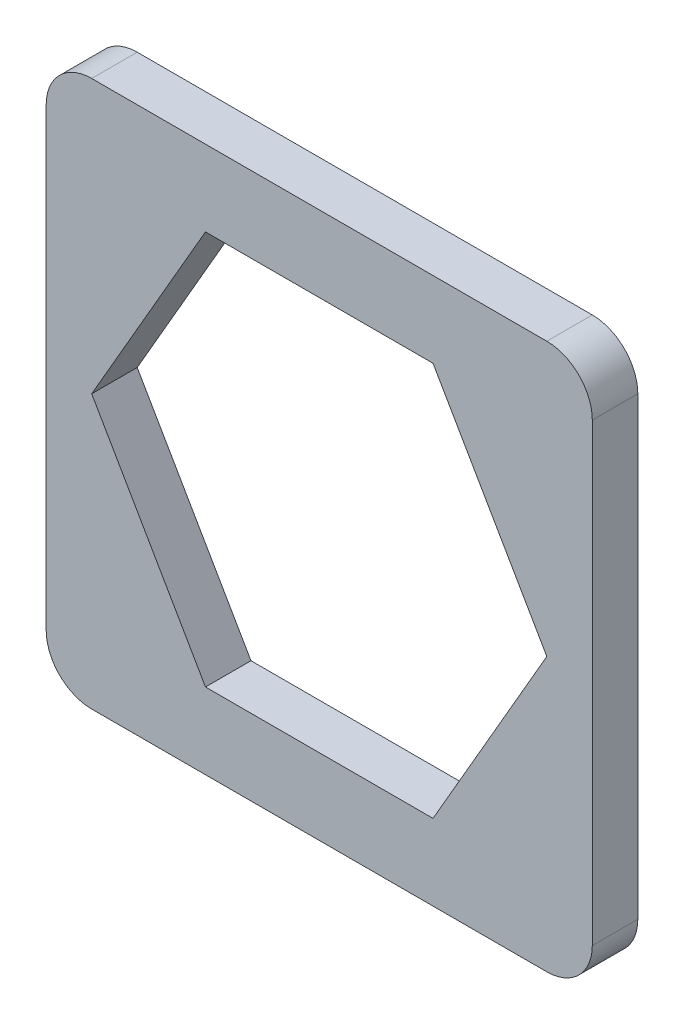
ISO-10303-21;
HEADER;
FILE_DESCRIPTION(('STEP AP214'),'2;1');
FILE_NAME('part.step','',(''),(''),'','','');
FILE_SCHEMA(('AUTOMOTIVE_DESIGN { 1 0 10303 214 1 1 1 1 }'));
ENDSEC;
DATA;
#1=APPLICATION_CONTEXT('core data for automotive mechanical design processes');
#2=APPLICATION_PROTOCOL_DEFINITION('international standard','automotive_design',2000,#1);
#3=PRODUCT_CONTEXT('',#1,'mechanical');
#4=PRODUCT('Part','Part','',(#3));
#5=PRODUCT_RELATED_PRODUCT_CATEGORY('part','',(#4));
#6=PRODUCT_DEFINITION_FORMATION('','',#4);
#7=PRODUCT_DEFINITION_CONTEXT('part definition',#1,'design');
#8=PRODUCT_DEFINITION('design','',#6,#7);
#9=PRODUCT_DEFINITION_SHAPE('','',#8);
#10=(LENGTH_UNIT() NAMED_UNIT(*) SI_UNIT(.MILLI.,.METRE.));
#11=(NAMED_UNIT(*) PLANE_ANGLE_UNIT() SI_UNIT($,.RADIAN.));
#12=(NAMED_UNIT(*) SI_UNIT($,.STERADIAN.) SOLID_ANGLE_UNIT());
#13=UNCERTAINTY_MEASURE_WITH_UNIT(LENGTH_MEASURE(1.E-05),#10,'distance_accuracy_value','');
#14=(GEOMETRIC_REPRESENTATION_CONTEXT(3) GLOBAL_UNCERTAINTY_ASSIGNED_CONTEXT((#13)) GLOBAL_UNIT_ASSIGNED_CONTEXT((#10,
#11,#12)) REPRESENTATION_CONTEXT('',''));
#15=CARTESIAN_POINT('',(0.,0.,0.));
#16=DIRECTION('',(0.,0.,1.));
#17=DIRECTION('',(1.,0.,0.));
#18=AXIS2_PLACEMENT_3D('',#15,#16,#17);
#19=CARTESIAN_POINT('',(-49.9999999999999,60.,10.));
#20=DIRECTION('',(0.,1.,0.));
#21=DIRECTION('',(0.,0.,1.));
#22=AXIS2_PLACEMENT_3D('',#19,#20,#21);
#23=PLANE('',#22);
#24=DIRECTION('',(1.,0.,0.));
#25=VECTOR('',#24,1.);
#26=CARTESIAN_POINT('',(-49.9999999999999,60.,0.));
#27=LINE('',#26,#25);
#28=CARTESIAN_POINT('',(-49.9999999999999,60.,0.));
#29=VERTEX_POINT('',#28);
#30=CARTESIAN_POINT('',(49.9999999999999,60.,0.));
#31=VERTEX_POINT('',#30);
#32=EDGE_CURVE('E179',#29,#31,#27,.T.);
#33=ORIENTED_EDGE('',*,*,#32,.F.);
#34=DIRECTION('',(0.,0.,-1.));
#35=VECTOR('',#34,1.);
#36=CARTESIAN_POINT('',(-49.9999999999999,60.,10.));
#37=LINE('',#36,#35);
#38=CARTESIAN_POINT('',(-49.9999999999999,60.,10.));
#39=VERTEX_POINT('',#38);
#40=EDGE_CURVE('E11',#39,#29,#37,.T.);
#41=ORIENTED_EDGE('',*,*,#40,.F.);
#42=DIRECTION('',(1.,0.,0.));
#43=VECTOR('',#42,1.);
#44=CARTESIAN_POINT('',(-49.9999999999999,60.,10.));
#45=LINE('',#44,#43);
#46=CARTESIAN_POINT('',(49.9999999999999,60.,10.));
#47=VERTEX_POINT('',#46);
#48=EDGE_CURVE('E187',#39,#47,#45,.T.);
#49=ORIENTED_EDGE('',*,*,#48,.T.);
#50=DIRECTION('',(0.,0.,-1.));
#51=VECTOR('',#50,1.);
#52=CARTESIAN_POINT('',(49.9999999999999,60.,10.));
#53=LINE('',#52,#51);
#54=EDGE_CURVE('E36',#47,#31,#53,.T.);
#55=ORIENTED_EDGE('',*,*,#54,.T.);
#56=EDGE_LOOP('',(#33,#41,#49,#55));
#57=FACE_BOUND('',#56,.T.);
#58=ADVANCED_FACE('F33',(#57),#23,.T.);
#59=CARTESIAN_POINT('',(-50.,50.,10.));
#60=DIRECTION('',(0.,0.,-1.));
#61=DIRECTION('',(-1.,0.,0.));
#62=AXIS2_PLACEMENT_3D('',#59,#60,#61);
#63=CYLINDRICAL_SURFACE('',#62,10.);
#64=CARTESIAN_POINT('',(-50.,50.,0.));
#65=DIRECTION('',(0.,0.,1.));
#66=DIRECTION('',(1.,0.,0.));
#67=AXIS2_PLACEMENT_3D('',#64,#65,#66);
#68=CIRCLE('',#67,10.);
#69=CARTESIAN_POINT('',(-60.,49.9999999999999,0.));
#70=VERTEX_POINT('',#69);
#71=EDGE_CURVE('E191',#29,#70,#68,.T.);
#72=ORIENTED_EDGE('',*,*,#71,.T.);
#73=DIRECTION('',(0.,0.,-1.));
#74=VECTOR('',#73,1.);
#75=CARTESIAN_POINT('',(-60.,49.9999999999999,10.));
#76=LINE('',#75,#74);
#77=CARTESIAN_POINT('',(-60.,49.9999999999999,10.));
#78=VERTEX_POINT('',#77);
#79=EDGE_CURVE('E41',#78,#70,#76,.T.);
#80=ORIENTED_EDGE('',*,*,#79,.F.);
#81=CARTESIAN_POINT('',(-50.,50.,10.));
#82=DIRECTION('',(0.,0.,1.));
#83=DIRECTION('',(1.,0.,0.));
#84=AXIS2_PLACEMENT_3D('',#81,#82,#83);
#85=CIRCLE('',#84,10.);
#86=EDGE_CURVE('E205',#39,#78,#85,.T.);
#87=ORIENTED_EDGE('',*,*,#86,.F.);
#88=ORIENTED_EDGE('',*,*,#40,.T.);
#89=EDGE_LOOP('',(#72,#80,#87,#88));
#90=FACE_BOUND('',#89,.T.);
#91=ADVANCED_FACE('F251',(#90),#63,.T.);
#92=CARTESIAN_POINT('',(-60.,49.9999999999999,10.));
#93=DIRECTION('',(1.,0.,0.));
#94=DIRECTION('',(0.,1.,0.));
#95=AXIS2_PLACEMENT_3D('',#92,#93,#94);
#96=PLANE('',#95);
#97=DIRECTION('',(0.,-1.,0.));
#98=VECTOR('',#97,1.);
#99=CARTESIAN_POINT('',(-60.,49.9999999999999,0.));
#100=LINE('',#99,#98);
#101=CARTESIAN_POINT('',(-60.,-49.9999999999999,0.));
#102=VERTEX_POINT('',#101);
#103=EDGE_CURVE('E222',#70,#102,#100,.T.);
#104=ORIENTED_EDGE('',*,*,#103,.T.);
#105=DIRECTION('',(0.,0.,-1.));
#106=VECTOR('',#105,1.);
#107=CARTESIAN_POINT('',(-60.,-49.9999999999999,10.));
#108=LINE('',#107,#106);
#109=CARTESIAN_POINT('',(-60.,-49.9999999999999,10.));
#110=VERTEX_POINT('',#109);
#111=EDGE_CURVE('E227',#110,#102,#108,.T.);
#112=ORIENTED_EDGE('',*,*,#111,.F.);
#113=DIRECTION('',(0.,-1.,0.));
#114=VECTOR('',#113,1.);
#115=CARTESIAN_POINT('',(-60.,49.9999999999999,10.));
#116=LINE('',#115,#114);
#117=EDGE_CURVE('E203',#78,#110,#116,.T.);
#118=ORIENTED_EDGE('',*,*,#117,.F.);
#119=ORIENTED_EDGE('',*,*,#79,.T.);
#120=EDGE_LOOP('',(#104,#112,#118,#119));
#121=FACE_BOUND('',#120,.T.);
#122=ADVANCED_FACE('F255',(#121),#96,.F.);
#123=CARTESIAN_POINT('',(-50.,-50.,10.));
#124=DIRECTION('',(0.,0.,-1.));
#125=DIRECTION('',(-1.,0.,0.));
#126=AXIS2_PLACEMENT_3D('',#123,#124,#125);
#127=CYLINDRICAL_SURFACE('',#126,10.);
#128=CARTESIAN_POINT('',(-50.,-50.,0.));
#129=DIRECTION('',(0.,0.,1.));
#130=DIRECTION('',(1.,0.,0.));
#131=AXIS2_PLACEMENT_3D('',#128,#129,#130);
#132=CIRCLE('',#131,10.);
#133=CARTESIAN_POINT('',(-49.9999999999999,-60.,0.));
#134=VERTEX_POINT('',#133);
#135=EDGE_CURVE('E220',#102,#134,#132,.T.);
#136=ORIENTED_EDGE('',*,*,#135,.T.);
#137=DIRECTION('',(0.,0.,-1.));
#138=VECTOR('',#137,1.);
#139=CARTESIAN_POINT('',(-49.9999999999999,-60.,10.));
#140=LINE('',#139,#138);
#141=CARTESIAN_POINT('',(-49.9999999999999,-60.,10.));
#142=VERTEX_POINT('',#141);
#143=EDGE_CURVE('E230',#142,#134,#140,.T.);
#144=ORIENTED_EDGE('',*,*,#143,.F.);
#145=CARTESIAN_POINT('',(-50.,-50.,10.));
#146=DIRECTION('',(0.,0.,1.));
#147=DIRECTION('',(1.,0.,0.));
#148=AXIS2_PLACEMENT_3D('',#145,#146,#147);
#149=CIRCLE('',#148,10.);
#150=EDGE_CURVE('E201',#110,#142,#149,.T.);
#151=ORIENTED_EDGE('',*,*,#150,.F.);
#152=ORIENTED_EDGE('',*,*,#111,.T.);
#153=EDGE_LOOP('',(#136,#144,#151,#152));
#154=FACE_BOUND('',#153,.T.);
#155=ADVANCED_FACE('F275',(#154),#127,.T.);
#156=CARTESIAN_POINT('',(-49.9999999999999,-60.,10.));
#157=DIRECTION('',(0.,1.,0.));
#158=DIRECTION('',(0.,0.,1.));
#159=AXIS2_PLACEMENT_3D('',#156,#157,#158);
#160=PLANE('',#159);
#161=DIRECTION('',(1.,0.,0.));
#162=VECTOR('',#161,1.);
#163=CARTESIAN_POINT('',(-49.9999999999999,-60.,0.));
#164=LINE('',#163,#162);
#165=CARTESIAN_POINT('',(49.9999999999999,-60.,0.));
#166=VERTEX_POINT('',#165);
#167=EDGE_CURVE('E218',#134,#166,#164,.T.);
#168=ORIENTED_EDGE('',*,*,#167,.T.);
#169=DIRECTION('',(0.,0.,-1.));
#170=VECTOR('',#169,1.);
#171=CARTESIAN_POINT('',(49.9999999999999,-60.,10.));
#172=LINE('',#171,#170);
#173=CARTESIAN_POINT('',(49.9999999999999,-60.,10.));
#174=VERTEX_POINT('',#173);
#175=EDGE_CURVE('E233',#174,#166,#172,.T.);
#176=ORIENTED_EDGE('',*,*,#175,.F.);
#177=DIRECTION('',(1.,0.,0.));
#178=VECTOR('',#177,1.);
#179=CARTESIAN_POINT('',(-49.9999999999999,-60.,10.));
#180=LINE('',#179,#178);
#181=EDGE_CURVE('E199',#142,#174,#180,.T.);
#182=ORIENTED_EDGE('',*,*,#181,.F.);
#183=ORIENTED_EDGE('',*,*,#143,.T.);
#184=EDGE_LOOP('',(#168,#176,#182,#183));
#185=FACE_BOUND('',#184,.T.);
#186=ADVANCED_FACE('F273',(#185),#160,.F.);
#187=CARTESIAN_POINT('',(50.,-50.,10.));
#188=DIRECTION('',(0.,0.,-1.));
#189=DIRECTION('',(-1.,0.,0.));
#190=AXIS2_PLACEMENT_3D('',#187,#188,#189);
#191=CYLINDRICAL_SURFACE('',#190,10.);
#192=CARTESIAN_POINT('',(50.,-50.,0.));
#193=DIRECTION('',(0.,0.,1.));
#194=DIRECTION('',(1.,0.,0.));
#195=AXIS2_PLACEMENT_3D('',#192,#193,#194);
#196=CIRCLE('',#195,10.);
#197=CARTESIAN_POINT('',(60.,-50.,0.));
#198=VERTEX_POINT('',#197);
#199=EDGE_CURVE('E215',#166,#198,#196,.T.);
#200=ORIENTED_EDGE('',*,*,#199,.T.);
#201=DIRECTION('',(0.,0.,-1.));
#202=VECTOR('',#201,1.);
#203=CARTESIAN_POINT('',(60.,-50.,10.));
#204=LINE('',#203,#202);
#205=CARTESIAN_POINT('',(60.,-50.,10.));
#206=VERTEX_POINT('',#205);
#207=EDGE_CURVE('E236',#206,#198,#204,.T.);
#208=ORIENTED_EDGE('',*,*,#207,.F.);
#209=CARTESIAN_POINT('',(50.,-50.,10.));
#210=DIRECTION('',(0.,0.,1.));
#211=DIRECTION('',(1.,0.,0.));
#212=AXIS2_PLACEMENT_3D('',#209,#210,#211);
#213=CIRCLE('',#212,10.);
#214=EDGE_CURVE('E197',#174,#206,#213,.T.);
#215=ORIENTED_EDGE('',*,*,#214,.F.);
#216=ORIENTED_EDGE('',*,*,#175,.T.);
#217=EDGE_LOOP('',(#200,#208,#215,#216));
#218=FACE_BOUND('',#217,.T.);
#219=ADVANCED_FACE('F269',(#218),#191,.T.);
#220=CARTESIAN_POINT('',(60.,49.9999999999999,10.));
#221=DIRECTION('',(1.,0.,0.));
#222=DIRECTION('',(0.,1.,0.));
#223=AXIS2_PLACEMENT_3D('',#220,#221,#222);
#224=PLANE('',#223);
#225=DIRECTION('',(0.,-1.,0.));
#226=VECTOR('',#225,1.);
#227=CARTESIAN_POINT('',(60.,49.9999999999999,0.));
#228=LINE('',#227,#226);
#229=CARTESIAN_POINT('',(60.,49.9999999999999,0.));
#230=VERTEX_POINT('',#229);
#231=EDGE_CURVE('E212',#230,#198,#228,.T.);
#232=ORIENTED_EDGE('',*,*,#231,.F.);
#233=DIRECTION('',(0.,0.,-1.));
#234=VECTOR('',#233,1.);
#235=CARTESIAN_POINT('',(60.,49.9999999999999,10.));
#236=LINE('',#235,#234);
#237=CARTESIAN_POINT('',(60.,49.9999999999999,10.));
#238=VERTEX_POINT('',#237);
#239=EDGE_CURVE('E237',#238,#230,#236,.T.);
#240=ORIENTED_EDGE('',*,*,#239,.F.);
#241=DIRECTION('',(0.,-1.,0.));
#242=VECTOR('',#241,1.);
#243=CARTESIAN_POINT('',(60.,49.9999999999999,10.));
#244=LINE('',#243,#242);
#245=EDGE_CURVE('E194',#238,#206,#244,.T.);
#246=ORIENTED_EDGE('',*,*,#245,.T.);
#247=ORIENTED_EDGE('',*,*,#207,.T.);
#248=EDGE_LOOP('',(#232,#240,#246,#247));
#249=FACE_BOUND('',#248,.T.);
#250=ADVANCED_FACE('F265',(#249),#224,.T.);
#251=CARTESIAN_POINT('',(50.,50.,10.));
#252=DIRECTION('',(0.,0.,-1.));
#253=DIRECTION('',(-1.,0.,0.));
#254=AXIS2_PLACEMENT_3D('',#251,#252,#253);
#255=CYLINDRICAL_SURFACE('',#254,10.);
#256=CARTESIAN_POINT('',(50.,50.,0.));
#257=DIRECTION('',(0.,0.,-1.));
#258=DIRECTION('',(-1.,0.,0.));
#259=AXIS2_PLACEMENT_3D('',#256,#257,#258);
#260=CIRCLE('',#259,10.);
#261=EDGE_CURVE('E209',#31,#230,#260,.T.);
#262=ORIENTED_EDGE('',*,*,#261,.F.);
#263=ORIENTED_EDGE('',*,*,#54,.F.);
#264=CARTESIAN_POINT('',(50.,50.,10.));
#265=DIRECTION('',(0.,0.,-1.));
#266=DIRECTION('',(-1.,0.,0.));
#267=AXIS2_PLACEMENT_3D('',#264,#265,#266);
#268=CIRCLE('',#267,10.);
#269=EDGE_CURVE('E190',#47,#238,#268,.T.);
#270=ORIENTED_EDGE('',*,*,#269,.T.);
#271=ORIENTED_EDGE('',*,*,#239,.T.);
#272=EDGE_LOOP('',(#262,#263,#270,#271));
#273=FACE_BOUND('',#272,.T.);
#274=ADVANCED_FACE('F245',(#273),#255,.T.);
#275=CARTESIAN_POINT('',(50.,50.,10.));
#276=DIRECTION('',(0.,0.,-1.));
#277=DIRECTION('',(-1.,0.,0.));
#278=AXIS2_PLACEMENT_3D('',#275,#276,#277);
#279=PLANE('',#278);
#280=DIRECTION('',(0.5,0.866025403784439,0.));
#281=VECTOR('',#280,1.);
#282=CARTESIAN_POINT('',(25.,-43.3012701892219,10.));
#283=LINE('',#282,#281);
#284=CARTESIAN_POINT('',(25.,-43.301270189222,10.));
#285=VERTEX_POINT('',#284);
#286=CARTESIAN_POINT('',(50.,0.,10.));
#287=VERTEX_POINT('',#286);
#288=EDGE_CURVE('E167',#285,#287,#283,.T.);
#289=ORIENTED_EDGE('',*,*,#288,.F.);
#290=DIRECTION('',(1.,0.,0.));
#291=VECTOR('',#290,1.);
#292=CARTESIAN_POINT('',(-25.,-43.3012701892219,10.));
#293=LINE('',#292,#291);
#294=CARTESIAN_POINT('',(-25.,-43.3012701892219,10.));
#295=VERTEX_POINT('',#294);
#296=EDGE_CURVE('E49',#295,#285,#293,.T.);
#297=ORIENTED_EDGE('',*,*,#296,.F.);
#298=DIRECTION('',(0.5,-0.866025403784439,0.));
#299=VECTOR('',#298,1.);
#300=CARTESIAN_POINT('',(-50.,0.,10.));
#301=LINE('',#300,#299);
#302=CARTESIAN_POINT('',(-50.,0.,10.));
#303=VERTEX_POINT('',#302);
#304=EDGE_CURVE('E153',#303,#295,#301,.T.);
#305=ORIENTED_EDGE('',*,*,#304,.F.);
#306=DIRECTION('',(-0.5,-0.866025403784439,0.));
#307=VECTOR('',#306,1.);
#308=CARTESIAN_POINT('',(-25.,43.3012701892219,10.));
#309=LINE('',#308,#307);
#310=CARTESIAN_POINT('',(-25.,43.3012701892219,10.));
#311=VERTEX_POINT('',#310);
#312=EDGE_CURVE('E156',#311,#303,#309,.T.);
#313=ORIENTED_EDGE('',*,*,#312,.F.);
#314=DIRECTION('',(-1.,0.,0.));
#315=VECTOR('',#314,1.);
#316=CARTESIAN_POINT('',(25.,43.3012701892219,10.));
#317=LINE('',#316,#315);
#318=CARTESIAN_POINT('',(25.,43.3012701892219,10.));
#319=VERTEX_POINT('',#318);
#320=EDGE_CURVE('E172',#319,#311,#317,.T.);
#321=ORIENTED_EDGE('',*,*,#320,.F.);
#322=DIRECTION('',(-0.5,0.866025403784439,0.));
#323=VECTOR('',#322,1.);
#324=CARTESIAN_POINT('',(50.,0.,10.));
#325=LINE('',#324,#323);
#326=EDGE_CURVE('E169',#287,#319,#325,.T.);
#327=ORIENTED_EDGE('',*,*,#326,.F.);
#328=EDGE_LOOP('',(#289,#297,#305,#313,#321,#327));
#329=FACE_BOUND('',#328,.T.);
#330=ORIENTED_EDGE('',*,*,#48,.F.);
#331=ORIENTED_EDGE('',*,*,#86,.T.);
#332=ORIENTED_EDGE('',*,*,#117,.T.);
#333=ORIENTED_EDGE('',*,*,#150,.T.);
#334=ORIENTED_EDGE('',*,*,#181,.T.);
#335=ORIENTED_EDGE('',*,*,#214,.T.);
#336=ORIENTED_EDGE('',*,*,#245,.F.);
#337=ORIENTED_EDGE('',*,*,#269,.F.);
#338=EDGE_LOOP('',(#330,#331,#332,#333,#334,#335,#336,#337));
#339=FACE_BOUND('',#338,.T.);
#340=ADVANCED_FACE('F259',(#329,#339),#279,.F.);
#341=CARTESIAN_POINT('',(50.,50.,0.));
#342=DIRECTION('',(0.,0.,-1.));
#343=DIRECTION('',(-1.,0.,0.));
#344=AXIS2_PLACEMENT_3D('',#341,#342,#343);
#345=PLANE('',#344);
#346=DIRECTION('',(1.,0.,0.));
#347=VECTOR('',#346,1.);
#348=CARTESIAN_POINT('',(-25.,-43.3012701892219,0.));
#349=LINE('',#348,#347);
#350=CARTESIAN_POINT('',(-25.,-43.3012701892219,0.));
#351=VERTEX_POINT('',#350);
#352=CARTESIAN_POINT('',(25.,-43.3012701892219,0.));
#353=VERTEX_POINT('',#352);
#354=EDGE_CURVE('E136',#351,#353,#349,.T.);
#355=ORIENTED_EDGE('',*,*,#354,.T.);
#356=DIRECTION('',(0.5,0.866025403784439,0.));
#357=VECTOR('',#356,1.);
#358=CARTESIAN_POINT('',(25.,-43.3012701892219,0.));
#359=LINE('',#358,#357);
#360=CARTESIAN_POINT('',(50.,0.,0.));
#361=VERTEX_POINT('',#360);
#362=EDGE_CURVE('E145',#353,#361,#359,.T.);
#363=ORIENTED_EDGE('',*,*,#362,.T.);
#364=DIRECTION('',(-0.5,0.866025403784439,0.));
#365=VECTOR('',#364,1.);
#366=CARTESIAN_POINT('',(50.,0.,0.));
#367=LINE('',#366,#365);
#368=CARTESIAN_POINT('',(25.,43.3012701892219,0.));
#369=VERTEX_POINT('',#368);
#370=EDGE_CURVE('E57',#361,#369,#367,.T.);
#371=ORIENTED_EDGE('',*,*,#370,.T.);
#372=DIRECTION('',(-1.,0.,0.));
#373=VECTOR('',#372,1.);
#374=CARTESIAN_POINT('',(25.,43.3012701892219,0.));
#375=LINE('',#374,#373);
#376=CARTESIAN_POINT('',(-25.,43.3012701892219,0.));
#377=VERTEX_POINT('',#376);
#378=EDGE_CURVE('E160',#369,#377,#375,.T.);
#379=ORIENTED_EDGE('',*,*,#378,.T.);
#380=DIRECTION('',(-0.5,-0.866025403784439,0.));
#381=VECTOR('',#380,1.);
#382=CARTESIAN_POINT('',(-25.,43.3012701892219,0.));
#383=LINE('',#382,#381);
#384=CARTESIAN_POINT('',(-50.,0.,0.));
#385=VERTEX_POINT('',#384);
#386=EDGE_CURVE('E163',#377,#385,#383,.T.);
#387=ORIENTED_EDGE('',*,*,#386,.T.);
#388=DIRECTION('',(0.5,-0.866025403784439,0.));
#389=VECTOR('',#388,1.);
#390=CARTESIAN_POINT('',(-50.,0.,0.));
#391=LINE('',#390,#389);
#392=EDGE_CURVE('E142',#385,#351,#391,.T.);
#393=ORIENTED_EDGE('',*,*,#392,.T.);
#394=EDGE_LOOP('',(#355,#363,#371,#379,#387,#393));
#395=FACE_BOUND('',#394,.T.);
#396=ORIENTED_EDGE('',*,*,#32,.T.);
#397=ORIENTED_EDGE('',*,*,#261,.T.);
#398=ORIENTED_EDGE('',*,*,#231,.T.);
#399=ORIENTED_EDGE('',*,*,#199,.F.);
#400=ORIENTED_EDGE('',*,*,#167,.F.);
#401=ORIENTED_EDGE('',*,*,#135,.F.);
#402=ORIENTED_EDGE('',*,*,#103,.F.);
#403=ORIENTED_EDGE('',*,*,#71,.F.);
#404=EDGE_LOOP('',(#396,#397,#398,#399,#400,#401,#402,#403));
#405=FACE_BOUND('',#404,.T.);
#406=ADVANCED_FACE('F149',(#395,#405),#345,.T.);
#407=CARTESIAN_POINT('',(-25.,-43.3012701892219,0.));
#408=DIRECTION('',(0.,-1.,0.));
#409=DIRECTION('',(0.,0.,-1.));
#410=AXIS2_PLACEMENT_3D('',#407,#408,#409);
#411=PLANE('',#410);
#412=ORIENTED_EDGE('',*,*,#296,.T.);
#413=DIRECTION('',(0.,0.,1.));
#414=VECTOR('',#413,1.);
#415=CARTESIAN_POINT('',(25.,-43.3012701892219,0.));
#416=LINE('',#415,#414);
#417=EDGE_CURVE('E132',#353,#285,#416,.T.);
#418=ORIENTED_EDGE('',*,*,#417,.F.);
#419=ORIENTED_EDGE('',*,*,#354,.F.);
#420=DIRECTION('',(0.,0.,1.));
#421=VECTOR('',#420,1.);
#422=CARTESIAN_POINT('',(-25.,-43.3012701892219,0.));
#423=LINE('',#422,#421);
#424=EDGE_CURVE('E177',#351,#295,#423,.T.);
#425=ORIENTED_EDGE('',*,*,#424,.T.);
#426=EDGE_LOOP('',(#412,#418,#419,#425));
#427=FACE_BOUND('',#426,.T.);
#428=ADVANCED_FACE('F134',(#427),#411,.F.);
#429=CARTESIAN_POINT('',(-50.,0.,0.));
#430=DIRECTION('',(-0.866025403784439,-0.5,0.));
#431=DIRECTION('',(0.5,-0.866025403784439,0.));
#432=AXIS2_PLACEMENT_3D('',#429,#430,#431);
#433=PLANE('',#432);
#434=ORIENTED_EDGE('',*,*,#304,.T.);
#435=ORIENTED_EDGE('',*,*,#424,.F.);
#436=ORIENTED_EDGE('',*,*,#392,.F.);
#437=DIRECTION('',(0.,0.,1.));
#438=VECTOR('',#437,1.);
#439=CARTESIAN_POINT('',(-50.,0.,0.));
#440=LINE('',#439,#438);
#441=EDGE_CURVE('E180',#385,#303,#440,.T.);
#442=ORIENTED_EDGE('',*,*,#441,.T.);
#443=EDGE_LOOP('',(#434,#435,#436,#442));
#444=FACE_BOUND('',#443,.T.);
#445=ADVANCED_FACE('F299',(#444),#433,.F.);
#446=CARTESIAN_POINT('',(-25.,43.3012701892219,0.));
#447=DIRECTION('',(-0.866025403784439,0.5,0.));
#448=DIRECTION('',(-0.5,-0.866025403784439,0.));
#449=AXIS2_PLACEMENT_3D('',#446,#447,#448);
#450=PLANE('',#449);
#451=ORIENTED_EDGE('',*,*,#312,.T.);
#452=ORIENTED_EDGE('',*,*,#441,.F.);
#453=ORIENTED_EDGE('',*,*,#386,.F.);
#454=DIRECTION('',(0.,0.,1.));
#455=VECTOR('',#454,1.);
#456=CARTESIAN_POINT('',(-25.,43.3012701892219,0.));
#457=LINE('',#456,#455);
#458=EDGE_CURVE('E182',#377,#311,#457,.T.);
#459=ORIENTED_EDGE('',*,*,#458,.T.);
#460=EDGE_LOOP('',(#451,#452,#453,#459));
#461=FACE_BOUND('',#460,.T.);
#462=ADVANCED_FACE('F308',(#461),#450,.F.);
#463=CARTESIAN_POINT('',(25.,43.3012701892219,0.));
#464=DIRECTION('',(0.,1.,0.));
#465=DIRECTION('',(-1.,0.,0.));
#466=AXIS2_PLACEMENT_3D('',#463,#464,#465);
#467=PLANE('',#466);
#468=ORIENTED_EDGE('',*,*,#320,.T.);
#469=ORIENTED_EDGE('',*,*,#458,.F.);
#470=ORIENTED_EDGE('',*,*,#378,.F.);
#471=DIRECTION('',(0.,0.,1.));
#472=VECTOR('',#471,1.);
#473=CARTESIAN_POINT('',(25.,43.3012701892219,0.));
#474=LINE('',#473,#472);
#475=EDGE_CURVE('E184',#369,#319,#474,.T.);
#476=ORIENTED_EDGE('',*,*,#475,.T.);
#477=EDGE_LOOP('',(#468,#469,#470,#476));
#478=FACE_BOUND('',#477,.T.);
#479=ADVANCED_FACE('F305',(#478),#467,.F.);
#480=CARTESIAN_POINT('',(50.,0.,0.));
#481=DIRECTION('',(0.866025403784439,0.5,0.));
#482=DIRECTION('',(-0.5,0.866025403784439,0.));
#483=AXIS2_PLACEMENT_3D('',#480,#481,#482);
#484=PLANE('',#483);
#485=ORIENTED_EDGE('',*,*,#326,.T.);
#486=ORIENTED_EDGE('',*,*,#475,.F.);
#487=ORIENTED_EDGE('',*,*,#370,.F.);
#488=DIRECTION('',(0.,0.,1.));
#489=VECTOR('',#488,1.);
#490=CARTESIAN_POINT('',(50.,0.,0.));
#491=LINE('',#490,#489);
#492=EDGE_CURVE('E141',#361,#287,#491,.T.);
#493=ORIENTED_EDGE('',*,*,#492,.T.);
#494=EDGE_LOOP('',(#485,#486,#487,#493));
#495=FACE_BOUND('',#494,.T.);
#496=ADVANCED_FACE('F302',(#495),#484,.F.);
#497=CARTESIAN_POINT('',(25.,-43.3012701892219,0.));
#498=DIRECTION('',(0.866025403784439,-0.5,0.));
#499=DIRECTION('',(0.5,0.866025403784439,0.));
#500=AXIS2_PLACEMENT_3D('',#497,#498,#499);
#501=PLANE('',#500);
#502=ORIENTED_EDGE('',*,*,#288,.T.);
#503=ORIENTED_EDGE('',*,*,#492,.F.);
#504=ORIENTED_EDGE('',*,*,#362,.F.);
#505=ORIENTED_EDGE('',*,*,#417,.T.);
#506=EDGE_LOOP('',(#502,#503,#504,#505));
#507=FACE_BOUND('',#506,.T.);
#508=ADVANCED_FACE('F146',(#507),#501,.F.);
#509=CLOSED_SHELL('',(#58,#91,#122,#155,#186,#219,#250,#274,#340,#406,#428,#445,#462,#479,#496,#508));
#510=MANIFOLD_SOLID_BREP('B2',#509);
#511=ADVANCED_BREP_SHAPE_REPRESENTATION('',(#18,#510),#14);
#512=SHAPE_DEFINITION_REPRESENTATION(#9,#511);
ENDSEC;
END-ISO-10303-21;
